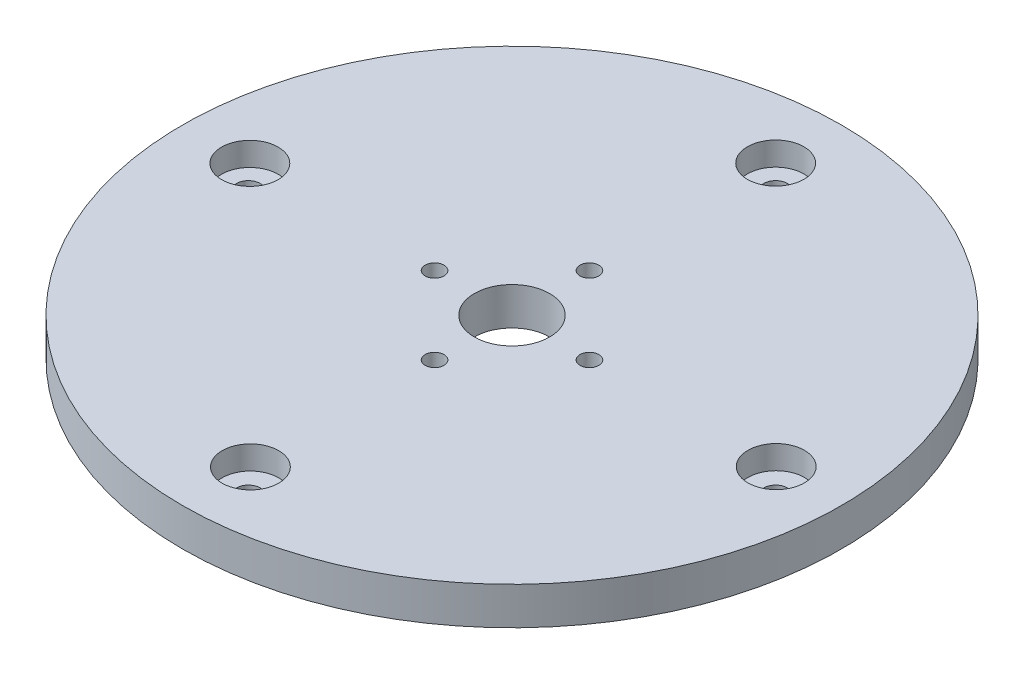
ISO-10303-21;
HEADER;
FILE_DESCRIPTION(('STEP AP214'),'2;1');
FILE_NAME('part.step','',(''),(''),'','','');
FILE_SCHEMA(('AUTOMOTIVE_DESIGN { 1 0 10303 214 1 1 1 1 }'));
ENDSEC;
DATA;
#1=APPLICATION_CONTEXT('core data for automotive mechanical design processes');
#2=APPLICATION_PROTOCOL_DEFINITION('international standard','automotive_design',2000,#1);
#3=PRODUCT_CONTEXT('',#1,'mechanical');
#4=PRODUCT('Part','Part','',(#3));
#5=PRODUCT_RELATED_PRODUCT_CATEGORY('part','',(#4));
#6=PRODUCT_DEFINITION_FORMATION('','',#4);
#7=PRODUCT_DEFINITION_CONTEXT('part definition',#1,'design');
#8=PRODUCT_DEFINITION('design','',#6,#7);
#9=PRODUCT_DEFINITION_SHAPE('','',#8);
#10=(LENGTH_UNIT() NAMED_UNIT(*) SI_UNIT(.MILLI.,.METRE.));
#11=(NAMED_UNIT(*) PLANE_ANGLE_UNIT() SI_UNIT($,.RADIAN.));
#12=(NAMED_UNIT(*) SI_UNIT($,.STERADIAN.) SOLID_ANGLE_UNIT());
#13=UNCERTAINTY_MEASURE_WITH_UNIT(LENGTH_MEASURE(1.E-05),#10,'distance_accuracy_value','');
#14=(GEOMETRIC_REPRESENTATION_CONTEXT(3) GLOBAL_UNCERTAINTY_ASSIGNED_CONTEXT((#13)) GLOBAL_UNIT_ASSIGNED_CONTEXT((#10,
#11,#12)) REPRESENTATION_CONTEXT('',''));
#15=CARTESIAN_POINT('',(0.,0.,0.));
#16=DIRECTION('',(0.,0.,1.));
#17=DIRECTION('',(1.,0.,0.));
#18=AXIS2_PLACEMENT_3D('',#15,#16,#17);
#19=CARTESIAN_POINT('',(4.64631786917647E-13,0.,8.2270625170551));
#20=DIRECTION('',(0.,1.,0.));
#21=DIRECTION('',(0.,0.,1.));
#22=AXIS2_PLACEMENT_3D('',#19,#20,#21);
#23=CYLINDRICAL_SURFACE('',#22,1.0000000000005);
#24=CARTESIAN_POINT('',(4.64631786917647E-13,4.,8.2270625170551));
#25=DIRECTION('',(0.,1.,0.));
#26=DIRECTION('',(0.,0.,1.));
#27=AXIS2_PLACEMENT_3D('',#24,#25,#26);
#28=CIRCLE('',#27,1.0000000000005);
#29=CARTESIAN_POINT('',(4.64631786917647E-13,4.,9.22706251705559));
#30=VERTEX_POINT('',#29);
#31=EDGE_CURVE('E128',#30,#30,#28,.T.);
#32=ORIENTED_EDGE('',*,*,#31,.T.);
#33=EDGE_LOOP('',(#32));
#34=FACE_BOUND('',#33,.T.);
#35=CARTESIAN_POINT('',(4.64631786917647E-13,2.5,8.2270625170551));
#36=DIRECTION('',(0.,-1.,0.));
#37=DIRECTION('',(0.,0.,-1.));
#38=AXIS2_PLACEMENT_3D('',#35,#36,#37);
#39=CIRCLE('',#38,1.0000000000005);
#40=CARTESIAN_POINT('',(4.64631786917647E-13,2.5,7.2270625170546));
#41=VERTEX_POINT('',#40);
#42=EDGE_CURVE('E47',#41,#41,#39,.F.);
#43=ORIENTED_EDGE('',*,*,#42,.F.);
#44=EDGE_LOOP('',(#43));
#45=FACE_BOUND('',#44,.T.);
#46=ADVANCED_FACE('F43',(#34,#45),#23,.F.);
#47=CARTESIAN_POINT('',(8.22706251705533,0.,-2.32315893458824E-13));
#48=DIRECTION('',(0.,1.,0.));
#49=DIRECTION('',(0.,0.,1.));
#50=AXIS2_PLACEMENT_3D('',#47,#48,#49);
#51=CYLINDRICAL_SURFACE('',#50,1.00000000000018);
#52=CARTESIAN_POINT('',(8.22706251705533,4.,-2.32315893458824E-13));
#53=DIRECTION('',(0.,1.,0.));
#54=DIRECTION('',(0.,0.,1.));
#55=AXIS2_PLACEMENT_3D('',#52,#53,#54);
#56=CIRCLE('',#55,1.00000000000018);
#57=CARTESIAN_POINT('',(8.22706251705533,4.,0.99999999999995));
#58=VERTEX_POINT('',#57);
#59=EDGE_CURVE('E136',#58,#58,#56,.T.);
#60=ORIENTED_EDGE('',*,*,#59,.T.);
#61=EDGE_LOOP('',(#60));
#62=FACE_BOUND('',#61,.T.);
#63=CARTESIAN_POINT('',(8.22706251705533,2.5,-2.32315893458824E-13));
#64=DIRECTION('',(0.,-1.,0.));
#65=DIRECTION('',(0.,0.,-1.));
#66=AXIS2_PLACEMENT_3D('',#63,#64,#65);
#67=CIRCLE('',#66,1.00000000000018);
#68=CARTESIAN_POINT('',(8.22706251705533,2.5,-1.00000000000041));
#69=VERTEX_POINT('',#68);
#70=EDGE_CURVE('E90',#69,#69,#67,.F.);
#71=ORIENTED_EDGE('',*,*,#70,.F.);
#72=EDGE_LOOP('',(#71));
#73=FACE_BOUND('',#72,.T.);
#74=ADVANCED_FACE('F179',(#62,#73),#51,.F.);
#75=CARTESIAN_POINT('',(0.,0.,-8.2270625170551));
#76=DIRECTION('',(0.,1.,0.));
#77=DIRECTION('',(0.,0.,1.));
#78=AXIS2_PLACEMENT_3D('',#75,#76,#77);
#79=CYLINDRICAL_SURFACE('',#78,1.);
#80=CARTESIAN_POINT('',(0.,4.,-8.2270625170551));
#81=DIRECTION('',(0.,1.,0.));
#82=DIRECTION('',(0.,0.,1.));
#83=AXIS2_PLACEMENT_3D('',#80,#81,#82);
#84=CIRCLE('',#83,1.);
#85=CARTESIAN_POINT('',(0.,4.,-7.2270625170551));
#86=VERTEX_POINT('',#85);
#87=EDGE_CURVE('E123',#86,#86,#84,.T.);
#88=ORIENTED_EDGE('',*,*,#87,.T.);
#89=EDGE_LOOP('',(#88));
#90=FACE_BOUND('',#89,.T.);
#91=CARTESIAN_POINT('',(0.,2.5,-8.2270625170551));
#92=DIRECTION('',(0.,-1.,0.));
#93=DIRECTION('',(0.,0.,-1.));
#94=AXIS2_PLACEMENT_3D('',#91,#92,#93);
#95=CIRCLE('',#94,1.);
#96=CARTESIAN_POINT('',(0.,2.5,-9.2270625170551));
#97=VERTEX_POINT('',#96);
#98=EDGE_CURVE('E86',#97,#97,#95,.F.);
#99=ORIENTED_EDGE('',*,*,#98,.F.);
#100=EDGE_LOOP('',(#99));
#101=FACE_BOUND('',#100,.T.);
#102=ADVANCED_FACE('F185',(#90,#101),#79,.F.);
#103=CARTESIAN_POINT('',(-8.22706251705486,0.,2.33323418036613E-13));
#104=DIRECTION('',(0.,1.,0.));
#105=DIRECTION('',(0.,0.,1.));
#106=AXIS2_PLACEMENT_3D('',#103,#104,#105);
#107=CYLINDRICAL_SURFACE('',#106,1.00000000000037);
#108=CARTESIAN_POINT('',(-8.22706251705486,4.,2.33323418036613E-13));
#109=DIRECTION('',(0.,1.,0.));
#110=DIRECTION('',(0.,0.,1.));
#111=AXIS2_PLACEMENT_3D('',#108,#109,#110);
#112=CIRCLE('',#111,1.00000000000037);
#113=CARTESIAN_POINT('',(-8.22706251705486,4.,1.00000000000061));
#114=VERTEX_POINT('',#113);
#115=EDGE_CURVE('E124',#114,#114,#112,.T.);
#116=ORIENTED_EDGE('',*,*,#115,.T.);
#117=EDGE_LOOP('',(#116));
#118=FACE_BOUND('',#117,.T.);
#119=CARTESIAN_POINT('',(-8.22706251705486,2.5,2.33323418036613E-13));
#120=DIRECTION('',(0.,-1.,0.));
#121=DIRECTION('',(0.,0.,-1.));
#122=AXIS2_PLACEMENT_3D('',#119,#120,#121);
#123=CIRCLE('',#122,1.00000000000037);
#124=CARTESIAN_POINT('',(-8.22706251705486,2.5,-1.00000000000014));
#125=VERTEX_POINT('',#124);
#126=EDGE_CURVE('E82',#125,#125,#123,.F.);
#127=ORIENTED_EDGE('',*,*,#126,.F.);
#128=EDGE_LOOP('',(#127));
#129=FACE_BOUND('',#128,.T.);
#130=ADVANCED_FACE('F157',(#118,#129),#107,.F.);
#131=CARTESIAN_POINT('',(0.,0.,28.));
#132=DIRECTION('',(0.,1.,0.));
#133=DIRECTION('',(0.,0.,1.));
#134=AXIS2_PLACEMENT_3D('',#131,#132,#133);
#135=CYLINDRICAL_SURFACE('',#134,1.25);
#136=CARTESIAN_POINT('',(0.,0.,28.));
#137=DIRECTION('',(0.,1.,0.));
#138=DIRECTION('',(0.,0.,-1.));
#139=AXIS2_PLACEMENT_3D('',#136,#137,#138);
#140=CIRCLE('',#139,1.25);
#141=CARTESIAN_POINT('',(0.,0.,26.75));
#142=VERTEX_POINT('',#141);
#143=EDGE_CURVE('E61',#142,#142,#140,.T.);
#144=ORIENTED_EDGE('',*,*,#143,.F.);
#145=EDGE_LOOP('',(#144));
#146=FACE_BOUND('',#145,.T.);
#147=CARTESIAN_POINT('',(0.,1.5,28.));
#148=DIRECTION('',(0.,1.,0.));
#149=DIRECTION('',(0.,0.,1.));
#150=AXIS2_PLACEMENT_3D('',#147,#148,#149);
#151=CIRCLE('',#150,1.25);
#152=CARTESIAN_POINT('',(0.,1.5,29.25));
#153=VERTEX_POINT('',#152);
#154=EDGE_CURVE('E77',#153,#153,#151,.F.);
#155=ORIENTED_EDGE('',*,*,#154,.F.);
#156=EDGE_LOOP('',(#155));
#157=FACE_BOUND('',#156,.T.);
#158=ADVANCED_FACE('F153',(#146,#157),#135,.F.);
#159=CARTESIAN_POINT('',(-28.,0.,-4.83987849797529E-13));
#160=DIRECTION('',(0.,1.,0.));
#161=DIRECTION('',(0.,0.,1.));
#162=AXIS2_PLACEMENT_3D('',#159,#160,#161);
#163=CYLINDRICAL_SURFACE('',#162,1.25);
#164=CARTESIAN_POINT('',(-28.,0.,-4.83987849797529E-13));
#165=DIRECTION('',(0.,1.,0.));
#166=DIRECTION('',(0.,0.,-1.));
#167=AXIS2_PLACEMENT_3D('',#164,#165,#166);
#168=CIRCLE('',#167,1.25);
#169=CARTESIAN_POINT('',(-28.,0.,-1.25000000000049));
#170=VERTEX_POINT('',#169);
#171=EDGE_CURVE('E129',#170,#170,#168,.T.);
#172=ORIENTED_EDGE('',*,*,#171,.F.);
#173=EDGE_LOOP('',(#172));
#174=FACE_BOUND('',#173,.T.);
#175=CARTESIAN_POINT('',(-28.,1.5,-4.83987849797529E-13));
#176=DIRECTION('',(0.,1.,0.));
#177=DIRECTION('',(0.,0.,1.));
#178=AXIS2_PLACEMENT_3D('',#175,#176,#177);
#179=CIRCLE('',#178,1.25);
#180=CARTESIAN_POINT('',(-28.,1.5,1.24999999999952));
#181=VERTEX_POINT('',#180);
#182=EDGE_CURVE('E73',#181,#181,#179,.F.);
#183=ORIENTED_EDGE('',*,*,#182,.F.);
#184=EDGE_LOOP('',(#183));
#185=FACE_BOUND('',#184,.T.);
#186=ADVANCED_FACE('F156',(#174,#185),#163,.F.);
#187=CARTESIAN_POINT('',(2.02962646689286E-13,0.,-28.));
#188=DIRECTION('',(0.,1.,0.));
#189=DIRECTION('',(0.,0.,1.));
#190=AXIS2_PLACEMENT_3D('',#187,#188,#189);
#191=CYLINDRICAL_SURFACE('',#190,1.25);
#192=CARTESIAN_POINT('',(2.02962646689286E-13,0.,-28.));
#193=DIRECTION('',(0.,1.,0.));
#194=DIRECTION('',(0.,0.,-1.));
#195=AXIS2_PLACEMENT_3D('',#192,#193,#194);
#196=CIRCLE('',#195,1.25);
#197=CARTESIAN_POINT('',(2.02962646689286E-13,0.,-29.25));
#198=VERTEX_POINT('',#197);
#199=EDGE_CURVE('E116',#198,#198,#196,.T.);
#200=ORIENTED_EDGE('',*,*,#199,.F.);
#201=EDGE_LOOP('',(#200));
#202=FACE_BOUND('',#201,.T.);
#203=CARTESIAN_POINT('',(2.02962646689286E-13,1.5,-28.));
#204=DIRECTION('',(0.,1.,0.));
#205=DIRECTION('',(0.,0.,1.));
#206=AXIS2_PLACEMENT_3D('',#203,#204,#205);
#207=CIRCLE('',#206,1.25);
#208=CARTESIAN_POINT('',(2.02962646689286E-13,1.5,-26.75));
#209=VERTEX_POINT('',#208);
#210=EDGE_CURVE('E68',#209,#209,#207,.F.);
#211=ORIENTED_EDGE('',*,*,#210,.F.);
#212=EDGE_LOOP('',(#211));
#213=FACE_BOUND('',#212,.T.);
#214=ADVANCED_FACE('F233',(#202,#213),#191,.F.);
#215=CARTESIAN_POINT('',(28.,0.,2.93284432462823E-13));
#216=DIRECTION('',(0.,1.,0.));
#217=DIRECTION('',(0.,0.,1.));
#218=AXIS2_PLACEMENT_3D('',#215,#216,#217);
#219=CYLINDRICAL_SURFACE('',#218,1.25);
#220=CARTESIAN_POINT('',(28.,0.,2.93284432462823E-13));
#221=DIRECTION('',(0.,1.,0.));
#222=DIRECTION('',(0.,0.,-1.));
#223=AXIS2_PLACEMENT_3D('',#220,#221,#222);
#224=CIRCLE('',#223,1.25);
#225=CARTESIAN_POINT('',(28.,0.,-1.24999999999971));
#226=VERTEX_POINT('',#225);
#227=EDGE_CURVE('E58',#226,#226,#224,.T.);
#228=ORIENTED_EDGE('',*,*,#227,.F.);
#229=EDGE_LOOP('',(#228));
#230=FACE_BOUND('',#229,.T.);
#231=CARTESIAN_POINT('',(28.,1.5,2.93284432462823E-13));
#232=DIRECTION('',(0.,1.,0.));
#233=DIRECTION('',(0.,0.,1.));
#234=AXIS2_PLACEMENT_3D('',#231,#232,#233);
#235=CIRCLE('',#234,1.25);
#236=CARTESIAN_POINT('',(28.,1.5,1.25000000000029));
#237=VERTEX_POINT('',#236);
#238=EDGE_CURVE('E64',#237,#237,#235,.F.);
#239=ORIENTED_EDGE('',*,*,#238,.F.);
#240=EDGE_LOOP('',(#239));
#241=FACE_BOUND('',#240,.T.);
#242=ADVANCED_FACE('F352',(#230,#241),#219,.F.);
#243=CARTESIAN_POINT('',(0.,4.,0.));
#244=DIRECTION('',(0.,-1.,0.));
#245=DIRECTION('',(0.,0.,-1.));
#246=AXIS2_PLACEMENT_3D('',#243,#244,#245);
#247=CYLINDRICAL_SURFACE('',#246,35.);
#248=CARTESIAN_POINT('',(0.,4.,0.));
#249=DIRECTION('',(0.,1.,0.));
#250=DIRECTION('',(0.,0.,1.));
#251=AXIS2_PLACEMENT_3D('',#248,#249,#250);
#252=CIRCLE('',#251,35.);
#253=CARTESIAN_POINT('',(0.,4.,35.));
#254=VERTEX_POINT('',#253);
#255=EDGE_CURVE('E10',#254,#254,#252,.T.);
#256=ORIENTED_EDGE('',*,*,#255,.F.);
#257=EDGE_LOOP('',(#256));
#258=FACE_BOUND('',#257,.T.);
#259=CARTESIAN_POINT('',(0.,0.,0.));
#260=DIRECTION('',(0.,1.,0.));
#261=DIRECTION('',(0.,0.,1.));
#262=AXIS2_PLACEMENT_3D('',#259,#260,#261);
#263=CIRCLE('',#262,35.);
#264=CARTESIAN_POINT('',(0.,0.,35.));
#265=VERTEX_POINT('',#264);
#266=EDGE_CURVE('E52',#265,#265,#263,.T.);
#267=ORIENTED_EDGE('',*,*,#266,.T.);
#268=EDGE_LOOP('',(#267));
#269=FACE_BOUND('',#268,.T.);
#270=ADVANCED_FACE('F45',(#258,#269),#247,.T.);
#271=CARTESIAN_POINT('',(0.,4.,0.));
#272=DIRECTION('',(0.,1.,0.));
#273=DIRECTION('',(0.,0.,1.));
#274=AXIS2_PLACEMENT_3D('',#271,#272,#273);
#275=PLANE('',#274);
#276=CARTESIAN_POINT('',(2.0122792321331E-13,4.,-28.));
#277=DIRECTION('',(0.,1.,0.));
#278=DIRECTION('',(0.,0.,1.));
#279=AXIS2_PLACEMENT_3D('',#276,#277,#278);
#280=CIRCLE('',#279,3.);
#281=CARTESIAN_POINT('',(2.0122792321331E-13,4.,-25.));
#282=VERTEX_POINT('',#281);
#283=EDGE_CURVE('E277',#282,#282,#280,.T.);
#284=ORIENTED_EDGE('',*,*,#283,.F.);
#285=EDGE_LOOP('',(#284));
#286=FACE_BOUND('',#285,.T.);
#287=CARTESIAN_POINT('',(-27.8904966087145,4.,-0.0519265819076757));
#288=DIRECTION('',(0.,1.,0.));
#289=DIRECTION('',(0.,0.,1.));
#290=AXIS2_PLACEMENT_3D('',#287,#288,#289);
#291=CIRCLE('',#290,2.99999999999999);
#292=CARTESIAN_POINT('',(-27.8904966087145,4.,2.94807341809232));
#293=VERTEX_POINT('',#292);
#294=EDGE_CURVE('E268',#293,#293,#291,.T.);
#295=ORIENTED_EDGE('',*,*,#294,.F.);
#296=EDGE_LOOP('',(#295));
#297=FACE_BOUND('',#296,.T.);
#298=CARTESIAN_POINT('',(27.9480734180925,4.,-0.109503391285352));
#299=DIRECTION('',(0.,1.,0.));
#300=DIRECTION('',(0.,0.,1.));
#301=AXIS2_PLACEMENT_3D('',#298,#299,#300);
#302=CIRCLE('',#301,3.);
#303=CARTESIAN_POINT('',(27.9480734180925,4.,2.89049660871465));
#304=VERTEX_POINT('',#303);
#305=EDGE_CURVE('E108',#304,#304,#302,.T.);
#306=ORIENTED_EDGE('',*,*,#305,.F.);
#307=EDGE_LOOP('',(#306));
#308=FACE_BOUND('',#307,.T.);
#309=CARTESIAN_POINT('',(0.0575768093778704,4.,27.838570026807));
#310=DIRECTION('',(0.,1.,0.));
#311=DIRECTION('',(0.,0.,1.));
#312=AXIS2_PLACEMENT_3D('',#309,#310,#311);
#313=CIRCLE('',#312,3.);
#314=CARTESIAN_POINT('',(0.0575768093778704,4.,30.838570026807));
#315=VERTEX_POINT('',#314);
#316=EDGE_CURVE('E97',#315,#315,#313,.T.);
#317=ORIENTED_EDGE('',*,*,#316,.F.);
#318=EDGE_LOOP('',(#317));
#319=FACE_BOUND('',#318,.T.);
#320=CARTESIAN_POINT('',(0.,4.,0.));
#321=DIRECTION('',(0.,1.,0.));
#322=DIRECTION('',(0.,0.,1.));
#323=AXIS2_PLACEMENT_3D('',#320,#321,#322);
#324=CIRCLE('',#323,4.);
#325=CARTESIAN_POINT('',(0.,4.,4.));
#326=VERTEX_POINT('',#325);
#327=EDGE_CURVE('E81',#326,#326,#324,.F.);
#328=ORIENTED_EDGE('',*,*,#327,.T.);
#329=EDGE_LOOP('',(#328));
#330=FACE_BOUND('',#329,.T.);
#331=ORIENTED_EDGE('',*,*,#115,.F.);
#332=EDGE_LOOP('',(#331));
#333=FACE_BOUND('',#332,.T.);
#334=ORIENTED_EDGE('',*,*,#87,.F.);
#335=EDGE_LOOP('',(#334));
#336=FACE_BOUND('',#335,.T.);
#337=ORIENTED_EDGE('',*,*,#59,.F.);
#338=EDGE_LOOP('',(#337));
#339=FACE_BOUND('',#338,.T.);
#340=ORIENTED_EDGE('',*,*,#31,.F.);
#341=EDGE_LOOP('',(#340));
#342=FACE_BOUND('',#341,.T.);
#343=ORIENTED_EDGE('',*,*,#255,.T.);
#344=EDGE_LOOP('',(#343));
#345=FACE_BOUND('',#344,.T.);
#346=ADVANCED_FACE('F193',(#286,#297,#308,#319,#330,#333,#336,#339,#342,#345),#275,.T.);
#347=CARTESIAN_POINT('',(0.,0.,0.));
#348=DIRECTION('',(0.,1.,0.));
#349=DIRECTION('',(0.,0.,1.));
#350=AXIS2_PLACEMENT_3D('',#347,#348,#349);
#351=PLANE('',#350);
#352=CARTESIAN_POINT('',(4.64631786917647E-13,0.,8.2270625170551));
#353=DIRECTION('',(0.,-1.,0.));
#354=DIRECTION('',(0.,0.,-1.));
#355=AXIS2_PLACEMENT_3D('',#352,#353,#354);
#356=CIRCLE('',#355,2.);
#357=CARTESIAN_POINT('',(4.64631786917647E-13,0.,6.2270625170551));
#358=VERTEX_POINT('',#357);
#359=EDGE_CURVE('E210',#358,#358,#356,.T.);
#360=ORIENTED_EDGE('',*,*,#359,.F.);
#361=EDGE_LOOP('',(#360));
#362=FACE_BOUND('',#361,.T.);
#363=CARTESIAN_POINT('',(8.22706251705533,0.,-2.35338467192193E-13));
#364=DIRECTION('',(0.,-1.,0.));
#365=DIRECTION('',(0.,0.,-1.));
#366=AXIS2_PLACEMENT_3D('',#363,#364,#365);
#367=CIRCLE('',#366,2.00000000000018);
#368=CARTESIAN_POINT('',(8.22706251705533,0.,-2.00000000000041));
#369=VERTEX_POINT('',#368);
#370=EDGE_CURVE('E214',#369,#369,#367,.T.);
#371=ORIENTED_EDGE('',*,*,#370,.F.);
#372=EDGE_LOOP('',(#371));
#373=FACE_BOUND('',#372,.T.);
#374=CARTESIAN_POINT('',(0.,0.,-8.2270625170551));
#375=DIRECTION('',(0.,-1.,0.));
#376=DIRECTION('',(0.,0.,-1.));
#377=AXIS2_PLACEMENT_3D('',#374,#375,#376);
#378=CIRCLE('',#377,2.00000000000049);
#379=CARTESIAN_POINT('',(0.,0.,-10.2270625170556));
#380=VERTEX_POINT('',#379);
#381=EDGE_CURVE('E218',#380,#380,#378,.T.);
#382=ORIENTED_EDGE('',*,*,#381,.F.);
#383=EDGE_LOOP('',(#382));
#384=FACE_BOUND('',#383,.T.);
#385=CARTESIAN_POINT('',(-8.22706251705487,0.,2.34330942614403E-13));
#386=DIRECTION('',(0.,-1.,0.));
#387=DIRECTION('',(0.,0.,-1.));
#388=AXIS2_PLACEMENT_3D('',#385,#386,#387);
#389=CIRCLE('',#388,2.00000000000037);
#390=CARTESIAN_POINT('',(-8.22706251705487,0.,-2.00000000000014));
#391=VERTEX_POINT('',#390);
#392=EDGE_CURVE('E222',#391,#391,#389,.T.);
#393=ORIENTED_EDGE('',*,*,#392,.F.);
#394=EDGE_LOOP('',(#393));
#395=FACE_BOUND('',#394,.T.);
#396=CARTESIAN_POINT('',(0.,0.,0.));
#397=DIRECTION('',(0.,-1.,0.));
#398=DIRECTION('',(0.,0.,-1.));
#399=AXIS2_PLACEMENT_3D('',#396,#397,#398);
#400=CIRCLE('',#399,4.);
#401=CARTESIAN_POINT('',(0.,0.,-4.));
#402=VERTEX_POINT('',#401);
#403=EDGE_CURVE('E112',#402,#402,#400,.T.);
#404=ORIENTED_EDGE('',*,*,#403,.F.);
#405=EDGE_LOOP('',(#404));
#406=FACE_BOUND('',#405,.T.);
#407=ORIENTED_EDGE('',*,*,#227,.T.);
#408=EDGE_LOOP('',(#407));
#409=FACE_BOUND('',#408,.T.);
#410=ORIENTED_EDGE('',*,*,#199,.T.);
#411=EDGE_LOOP('',(#410));
#412=FACE_BOUND('',#411,.T.);
#413=ORIENTED_EDGE('',*,*,#171,.T.);
#414=EDGE_LOOP('',(#413));
#415=FACE_BOUND('',#414,.T.);
#416=ORIENTED_EDGE('',*,*,#143,.T.);
#417=EDGE_LOOP('',(#416));
#418=FACE_BOUND('',#417,.T.);
#419=ORIENTED_EDGE('',*,*,#266,.F.);
#420=EDGE_LOOP('',(#419));
#421=FACE_BOUND('',#420,.T.);
#422=ADVANCED_FACE('F150',(#362,#373,#384,#395,#406,#409,#412,#415,#418,#421),#351,.F.);
#423=CARTESIAN_POINT('',(0.,4.001,0.));
#424=DIRECTION('',(0.,-1.,0.));
#425=DIRECTION('',(0.,0.,-1.));
#426=AXIS2_PLACEMENT_3D('',#423,#424,#425);
#427=CYLINDRICAL_SURFACE('',#426,4.);
#428=ORIENTED_EDGE('',*,*,#327,.F.);
#429=EDGE_LOOP('',(#428));
#430=FACE_BOUND('',#429,.T.);
#431=ORIENTED_EDGE('',*,*,#403,.T.);
#432=EDGE_LOOP('',(#431));
#433=FACE_BOUND('',#432,.T.);
#434=ADVANCED_FACE('F197',(#430,#433),#427,.F.);
#435=CARTESIAN_POINT('',(27.9480734180925,1.5,-0.109503391285352));
#436=DIRECTION('',(0.,1.,0.));
#437=DIRECTION('',(0.,0.,1.));
#438=AXIS2_PLACEMENT_3D('',#435,#436,#437);
#439=PLANE('',#438);
#440=CARTESIAN_POINT('',(27.9480734180925,1.5,-0.109503391285352));
#441=DIRECTION('',(0.,1.,0.));
#442=DIRECTION('',(0.,0.,1.));
#443=AXIS2_PLACEMENT_3D('',#440,#441,#442);
#444=CIRCLE('',#443,3.);
#445=CARTESIAN_POINT('',(27.9480734180925,1.5,2.89049660871465));
#446=VERTEX_POINT('',#445);
#447=EDGE_CURVE('E262',#446,#446,#444,.T.);
#448=ORIENTED_EDGE('',*,*,#447,.T.);
#449=EDGE_LOOP('',(#448));
#450=FACE_BOUND('',#449,.T.);
#451=ORIENTED_EDGE('',*,*,#238,.T.);
#452=EDGE_LOOP('',(#451));
#453=FACE_BOUND('',#452,.T.);
#454=ADVANCED_FACE('F204',(#450,#453),#439,.T.);
#455=CARTESIAN_POINT('',(27.9480734180925,1.5,-0.109503391285352));
#456=DIRECTION('',(0.,1.,0.));
#457=DIRECTION('',(0.,0.,1.));
#458=AXIS2_PLACEMENT_3D('',#455,#456,#457);
#459=CYLINDRICAL_SURFACE('',#458,3.);
#460=ORIENTED_EDGE('',*,*,#447,.F.);
#461=EDGE_LOOP('',(#460));
#462=FACE_BOUND('',#461,.T.);
#463=ORIENTED_EDGE('',*,*,#305,.T.);
#464=EDGE_LOOP('',(#463));
#465=FACE_BOUND('',#464,.T.);
#466=ADVANCED_FACE('F251',(#462,#465),#459,.F.);
#467=CARTESIAN_POINT('',(2.0122792321331E-13,1.5,-28.));
#468=DIRECTION('',(0.,1.,0.));
#469=DIRECTION('',(0.,0.,1.));
#470=AXIS2_PLACEMENT_3D('',#467,#468,#469);
#471=PLANE('',#470);
#472=CARTESIAN_POINT('',(2.0122792321331E-13,1.5,-28.));
#473=DIRECTION('',(0.,1.,0.));
#474=DIRECTION('',(0.,0.,1.));
#475=AXIS2_PLACEMENT_3D('',#472,#473,#474);
#476=CIRCLE('',#475,3.);
#477=CARTESIAN_POINT('',(2.0122792321331E-13,1.5,-25.));
#478=VERTEX_POINT('',#477);
#479=EDGE_CURVE('E69',#478,#478,#476,.T.);
#480=ORIENTED_EDGE('',*,*,#479,.T.);
#481=EDGE_LOOP('',(#480));
#482=FACE_BOUND('',#481,.T.);
#483=ORIENTED_EDGE('',*,*,#210,.T.);
#484=EDGE_LOOP('',(#483));
#485=FACE_BOUND('',#484,.T.);
#486=ADVANCED_FACE('F244',(#482,#485),#471,.T.);
#487=CARTESIAN_POINT('',(2.0122792321331E-13,1.5,-28.));
#488=DIRECTION('',(0.,1.,0.));
#489=DIRECTION('',(0.,0.,1.));
#490=AXIS2_PLACEMENT_3D('',#487,#488,#489);
#491=CYLINDRICAL_SURFACE('',#490,3.);
#492=ORIENTED_EDGE('',*,*,#479,.F.);
#493=EDGE_LOOP('',(#492));
#494=FACE_BOUND('',#493,.T.);
#495=ORIENTED_EDGE('',*,*,#283,.T.);
#496=EDGE_LOOP('',(#495));
#497=FACE_BOUND('',#496,.T.);
#498=ADVANCED_FACE('F238',(#494,#497),#491,.F.);
#499=CARTESIAN_POINT('',(-27.8904966087145,1.5,-0.0519265819076757));
#500=DIRECTION('',(0.,1.,0.));
#501=DIRECTION('',(0.,0.,1.));
#502=AXIS2_PLACEMENT_3D('',#499,#500,#501);
#503=PLANE('',#502);
#504=CARTESIAN_POINT('',(-27.8904966087145,1.5,-0.0519265819076757));
#505=DIRECTION('',(0.,1.,0.));
#506=DIRECTION('',(0.,0.,1.));
#507=AXIS2_PLACEMENT_3D('',#504,#505,#506);
#508=CIRCLE('',#507,2.99999999999999);
#509=CARTESIAN_POINT('',(-27.8904966087145,1.5,2.94807341809232));
#510=VERTEX_POINT('',#509);
#511=EDGE_CURVE('E274',#510,#510,#508,.T.);
#512=ORIENTED_EDGE('',*,*,#511,.T.);
#513=EDGE_LOOP('',(#512));
#514=FACE_BOUND('',#513,.T.);
#515=ORIENTED_EDGE('',*,*,#182,.T.);
#516=EDGE_LOOP('',(#515));
#517=FACE_BOUND('',#516,.T.);
#518=ADVANCED_FACE('F174',(#514,#517),#503,.T.);
#519=CARTESIAN_POINT('',(-27.8904966087145,1.5,-0.0519265819076757));
#520=DIRECTION('',(0.,1.,0.));
#521=DIRECTION('',(0.,0.,1.));
#522=AXIS2_PLACEMENT_3D('',#519,#520,#521);
#523=CYLINDRICAL_SURFACE('',#522,2.99999999999999);
#524=ORIENTED_EDGE('',*,*,#511,.F.);
#525=EDGE_LOOP('',(#524));
#526=FACE_BOUND('',#525,.T.);
#527=ORIENTED_EDGE('',*,*,#294,.T.);
#528=EDGE_LOOP('',(#527));
#529=FACE_BOUND('',#528,.T.);
#530=ADVANCED_FACE('F164',(#526,#529),#523,.F.);
#531=CARTESIAN_POINT('',(0.0575768093778704,1.5,27.838570026807));
#532=DIRECTION('',(0.,1.,0.));
#533=DIRECTION('',(0.,0.,1.));
#534=AXIS2_PLACEMENT_3D('',#531,#532,#533);
#535=PLANE('',#534);
#536=CARTESIAN_POINT('',(0.0575768093778704,1.5,27.838570026807));
#537=DIRECTION('',(0.,1.,0.));
#538=DIRECTION('',(0.,0.,1.));
#539=AXIS2_PLACEMENT_3D('',#536,#537,#538);
#540=CIRCLE('',#539,3.);
#541=CARTESIAN_POINT('',(0.0575768093778704,1.5,30.838570026807));
#542=VERTEX_POINT('',#541);
#543=EDGE_CURVE('E102',#542,#542,#540,.T.);
#544=ORIENTED_EDGE('',*,*,#543,.T.);
#545=EDGE_LOOP('',(#544));
#546=FACE_BOUND('',#545,.T.);
#547=ORIENTED_EDGE('',*,*,#154,.T.);
#548=EDGE_LOOP('',(#547));
#549=FACE_BOUND('',#548,.T.);
#550=ADVANCED_FACE('F161',(#546,#549),#535,.T.);
#551=CARTESIAN_POINT('',(0.0575768093778704,1.5,27.838570026807));
#552=DIRECTION('',(0.,1.,0.));
#553=DIRECTION('',(0.,0.,1.));
#554=AXIS2_PLACEMENT_3D('',#551,#552,#553);
#555=CYLINDRICAL_SURFACE('',#554,3.);
#556=ORIENTED_EDGE('',*,*,#543,.F.);
#557=EDGE_LOOP('',(#556));
#558=FACE_BOUND('',#557,.T.);
#559=ORIENTED_EDGE('',*,*,#316,.T.);
#560=EDGE_LOOP('',(#559));
#561=FACE_BOUND('',#560,.T.);
#562=ADVANCED_FACE('F163',(#558,#561),#555,.F.);
#563=CARTESIAN_POINT('',(-8.22706251705487,2.5,2.34330942614403E-13));
#564=DIRECTION('',(0.,-1.,0.));
#565=DIRECTION('',(0.,0.,-1.));
#566=AXIS2_PLACEMENT_3D('',#563,#564,#565);
#567=PLANE('',#566);
#568=CARTESIAN_POINT('',(-8.22706251705487,2.5,2.34330942614403E-13));
#569=DIRECTION('',(0.,-1.,0.));
#570=DIRECTION('',(0.,0.,-1.));
#571=AXIS2_PLACEMENT_3D('',#568,#569,#570);
#572=CIRCLE('',#571,2.00000000000037);
#573=CARTESIAN_POINT('',(-8.22706251705487,2.5,-2.00000000000014));
#574=VERTEX_POINT('',#573);
#575=EDGE_CURVE('E286',#574,#574,#572,.T.);
#576=ORIENTED_EDGE('',*,*,#575,.T.);
#577=EDGE_LOOP('',(#576));
#578=FACE_BOUND('',#577,.T.);
#579=ORIENTED_EDGE('',*,*,#126,.T.);
#580=EDGE_LOOP('',(#579));
#581=FACE_BOUND('',#580,.T.);
#582=ADVANCED_FACE('F171',(#578,#581),#567,.T.);
#583=CARTESIAN_POINT('',(-8.22706251705487,2.5,2.34330942614403E-13));
#584=DIRECTION('',(0.,-1.,0.));
#585=DIRECTION('',(0.,0.,-1.));
#586=AXIS2_PLACEMENT_3D('',#583,#584,#585);
#587=CYLINDRICAL_SURFACE('',#586,2.00000000000037);
#588=ORIENTED_EDGE('',*,*,#575,.F.);
#589=EDGE_LOOP('',(#588));
#590=FACE_BOUND('',#589,.T.);
#591=ORIENTED_EDGE('',*,*,#392,.T.);
#592=EDGE_LOOP('',(#591));
#593=FACE_BOUND('',#592,.T.);
#594=ADVANCED_FACE('F331',(#590,#593),#587,.F.);
#595=CARTESIAN_POINT('',(0.,2.5,-8.2270625170551));
#596=DIRECTION('',(0.,-1.,0.));
#597=DIRECTION('',(0.,0.,-1.));
#598=AXIS2_PLACEMENT_3D('',#595,#596,#597);
#599=PLANE('',#598);
#600=CARTESIAN_POINT('',(0.,2.5,-8.2270625170551));
#601=DIRECTION('',(0.,-1.,0.));
#602=DIRECTION('',(0.,0.,-1.));
#603=AXIS2_PLACEMENT_3D('',#600,#601,#602);
#604=CIRCLE('',#603,2.00000000000049);
#605=CARTESIAN_POINT('',(0.,2.5,-10.2270625170556));
#606=VERTEX_POINT('',#605);
#607=EDGE_CURVE('E292',#606,#606,#604,.T.);
#608=ORIENTED_EDGE('',*,*,#607,.T.);
#609=EDGE_LOOP('',(#608));
#610=FACE_BOUND('',#609,.T.);
#611=ORIENTED_EDGE('',*,*,#98,.T.);
#612=EDGE_LOOP('',(#611));
#613=FACE_BOUND('',#612,.T.);
#614=ADVANCED_FACE('F328',(#610,#613),#599,.T.);
#615=CARTESIAN_POINT('',(0.,2.5,-8.2270625170551));
#616=DIRECTION('',(0.,-1.,0.));
#617=DIRECTION('',(0.,0.,-1.));
#618=AXIS2_PLACEMENT_3D('',#615,#616,#617);
#619=CYLINDRICAL_SURFACE('',#618,2.00000000000049);
#620=ORIENTED_EDGE('',*,*,#607,.F.);
#621=EDGE_LOOP('',(#620));
#622=FACE_BOUND('',#621,.T.);
#623=ORIENTED_EDGE('',*,*,#381,.T.);
#624=EDGE_LOOP('',(#623));
#625=FACE_BOUND('',#624,.T.);
#626=ADVANCED_FACE('F323',(#622,#625),#619,.F.);
#627=CARTESIAN_POINT('',(8.22706251705533,2.5,-2.35338467192193E-13));
#628=DIRECTION('',(0.,-1.,0.));
#629=DIRECTION('',(0.,0.,-1.));
#630=AXIS2_PLACEMENT_3D('',#627,#628,#629);
#631=PLANE('',#630);
#632=CARTESIAN_POINT('',(8.22706251705533,2.5,-2.35338467192193E-13));
#633=DIRECTION('',(0.,-1.,0.));
#634=DIRECTION('',(0.,0.,-1.));
#635=AXIS2_PLACEMENT_3D('',#632,#633,#634);
#636=CIRCLE('',#635,2.00000000000018);
#637=CARTESIAN_POINT('',(8.22706251705533,2.5,-2.00000000000041));
#638=VERTEX_POINT('',#637);
#639=EDGE_CURVE('E298',#638,#638,#636,.T.);
#640=ORIENTED_EDGE('',*,*,#639,.T.);
#641=EDGE_LOOP('',(#640));
#642=FACE_BOUND('',#641,.T.);
#643=ORIENTED_EDGE('',*,*,#70,.T.);
#644=EDGE_LOOP('',(#643));
#645=FACE_BOUND('',#644,.T.);
#646=ADVANCED_FACE('F320',(#642,#645),#631,.T.);
#647=CARTESIAN_POINT('',(8.22706251705533,2.5,-2.35338467192193E-13));
#648=DIRECTION('',(0.,-1.,0.));
#649=DIRECTION('',(0.,0.,-1.));
#650=AXIS2_PLACEMENT_3D('',#647,#648,#649);
#651=CYLINDRICAL_SURFACE('',#650,2.00000000000018);
#652=ORIENTED_EDGE('',*,*,#639,.F.);
#653=EDGE_LOOP('',(#652));
#654=FACE_BOUND('',#653,.T.);
#655=ORIENTED_EDGE('',*,*,#370,.T.);
#656=EDGE_LOOP('',(#655));
#657=FACE_BOUND('',#656,.T.);
#658=ADVANCED_FACE('F317',(#654,#657),#651,.F.);
#659=CARTESIAN_POINT('',(4.64631786917647E-13,2.5,8.2270625170551));
#660=DIRECTION('',(0.,-1.,0.));
#661=DIRECTION('',(0.,0.,-1.));
#662=AXIS2_PLACEMENT_3D('',#659,#660,#661);
#663=PLANE('',#662);
#664=CARTESIAN_POINT('',(4.64631786917647E-13,2.5,8.2270625170551));
#665=DIRECTION('',(0.,-1.,0.));
#666=DIRECTION('',(0.,0.,-1.));
#667=AXIS2_PLACEMENT_3D('',#664,#665,#666);
#668=CIRCLE('',#667,2.);
#669=CARTESIAN_POINT('',(4.64631786917647E-13,2.5,6.2270625170551));
#670=VERTEX_POINT('',#669);
#671=EDGE_CURVE('E87',#670,#670,#668,.T.);
#672=ORIENTED_EDGE('',*,*,#671,.T.);
#673=EDGE_LOOP('',(#672));
#674=FACE_BOUND('',#673,.T.);
#675=ORIENTED_EDGE('',*,*,#42,.T.);
#676=EDGE_LOOP('',(#675));
#677=FACE_BOUND('',#676,.T.);
#678=ADVANCED_FACE('F308',(#674,#677),#663,.T.);
#679=CARTESIAN_POINT('',(4.64631786917647E-13,2.5,8.2270625170551));
#680=DIRECTION('',(0.,-1.,0.));
#681=DIRECTION('',(0.,0.,-1.));
#682=AXIS2_PLACEMENT_3D('',#679,#680,#681);
#683=CYLINDRICAL_SURFACE('',#682,2.);
#684=ORIENTED_EDGE('',*,*,#671,.F.);
#685=EDGE_LOOP('',(#684));
#686=FACE_BOUND('',#685,.T.);
#687=ORIENTED_EDGE('',*,*,#359,.T.);
#688=EDGE_LOOP('',(#687));
#689=FACE_BOUND('',#688,.T.);
#690=ADVANCED_FACE('F310',(#686,#689),#683,.F.);
#691=CLOSED_SHELL('',(#46,#74,#102,#130,#158,#186,#214,#242,#270,#346,#422,#434,#454,#466,#486,
#498,#518,#530,#550,#562,#582,#594,#614,#626,#646,#658,#678,#690));
#692=MANIFOLD_SOLID_BREP('B2',#691);
#693=ADVANCED_BREP_SHAPE_REPRESENTATION('',(#18,#692),#14);
#694=SHAPE_DEFINITION_REPRESENTATION(#9,#693);
ENDSEC;
END-ISO-10303-21;
